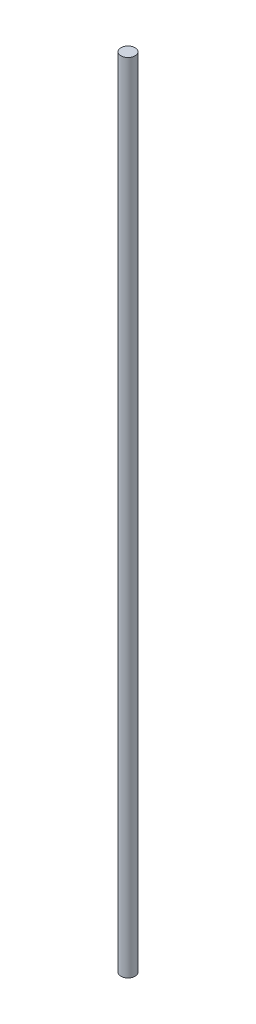
ISO-10303-21;
HEADER;
FILE_DESCRIPTION(('STEP AP214'),'2;1');
FILE_NAME('part.step','',(''),(''),'','','');
FILE_SCHEMA(('AUTOMOTIVE_DESIGN { 1 0 10303 214 1 1 1 1 }'));
ENDSEC;
DATA;
#1=APPLICATION_CONTEXT('core data for automotive mechanical design processes');
#2=APPLICATION_PROTOCOL_DEFINITION('international standard','automotive_design',2000,#1);
#3=PRODUCT_CONTEXT('',#1,'mechanical');
#4=PRODUCT('Part','Part','',(#3));
#5=PRODUCT_RELATED_PRODUCT_CATEGORY('part','',(#4));
#6=PRODUCT_DEFINITION_FORMATION('','',#4);
#7=PRODUCT_DEFINITION_CONTEXT('part definition',#1,'design');
#8=PRODUCT_DEFINITION('design','',#6,#7);
#9=PRODUCT_DEFINITION_SHAPE('','',#8);
#10=(LENGTH_UNIT() NAMED_UNIT(*) SI_UNIT(.MILLI.,.METRE.));
#11=(NAMED_UNIT(*) PLANE_ANGLE_UNIT() SI_UNIT($,.RADIAN.));
#12=(NAMED_UNIT(*) SI_UNIT($,.STERADIAN.) SOLID_ANGLE_UNIT());
#13=UNCERTAINTY_MEASURE_WITH_UNIT(LENGTH_MEASURE(1.E-05),#10,'distance_accuracy_value','');
#14=(GEOMETRIC_REPRESENTATION_CONTEXT(3) GLOBAL_UNCERTAINTY_ASSIGNED_CONTEXT((#13)) GLOBAL_UNIT_ASSIGNED_CONTEXT((#10,
#11,#12)) REPRESENTATION_CONTEXT('',''));
#15=CARTESIAN_POINT('',(0.,0.,0.));
#16=DIRECTION('',(0.,0.,1.));
#17=DIRECTION('',(1.,0.,0.));
#18=AXIS2_PLACEMENT_3D('',#15,#16,#17);
#19=CARTESIAN_POINT('',(0.,680.,0.));
#20=DIRECTION('',(0.,-1.,0.));
#21=DIRECTION('',(0.,0.,-1.));
#22=AXIS2_PLACEMENT_3D('',#19,#20,#21);
#23=CYLINDRICAL_SURFACE('',#22,6.);
#24=CARTESIAN_POINT('',(0.,680.,0.));
#25=DIRECTION('',(0.,1.,0.));
#26=DIRECTION('',(0.,0.,1.));
#27=AXIS2_PLACEMENT_3D('',#24,#25,#26);
#28=CIRCLE('',#27,6.);
#29=CARTESIAN_POINT('',(0.,680.,6.));
#30=VERTEX_POINT('',#29);
#31=EDGE_CURVE('E10',#30,#30,#28,.T.);
#32=ORIENTED_EDGE('',*,*,#31,.F.);
#33=EDGE_LOOP('',(#32));
#34=FACE_BOUND('',#33,.T.);
#35=CARTESIAN_POINT('',(0.,0.,0.));
#36=DIRECTION('',(0.,1.,0.));
#37=DIRECTION('',(0.,0.,1.));
#38=AXIS2_PLACEMENT_3D('',#35,#36,#37);
#39=CIRCLE('',#38,6.);
#40=CARTESIAN_POINT('',(0.,0.,6.));
#41=VERTEX_POINT('',#40);
#42=EDGE_CURVE('E38',#41,#41,#39,.T.);
#43=ORIENTED_EDGE('',*,*,#42,.T.);
#44=EDGE_LOOP('',(#43));
#45=FACE_BOUND('',#44,.T.);
#46=ADVANCED_FACE('F35',(#34,#45),#23,.T.);
#47=CARTESIAN_POINT('',(0.,680.,0.));
#48=DIRECTION('',(0.,1.,0.));
#49=DIRECTION('',(0.,0.,1.));
#50=AXIS2_PLACEMENT_3D('',#47,#48,#49);
#51=PLANE('',#50);
#52=ORIENTED_EDGE('',*,*,#31,.T.);
#53=EDGE_LOOP('',(#52));
#54=FACE_BOUND('',#53,.T.);
#55=ADVANCED_FACE('F50',(#54),#51,.T.);
#56=CARTESIAN_POINT('',(0.,0.,0.));
#57=DIRECTION('',(0.,1.,0.));
#58=DIRECTION('',(0.,0.,1.));
#59=AXIS2_PLACEMENT_3D('',#56,#57,#58);
#60=PLANE('',#59);
#61=ORIENTED_EDGE('',*,*,#42,.F.);
#62=EDGE_LOOP('',(#61));
#63=FACE_BOUND('',#62,.T.);
#64=ADVANCED_FACE('F48',(#63),#60,.F.);
#65=CLOSED_SHELL('',(#46,#55,#64));
#66=MANIFOLD_SOLID_BREP('B2',#65);
#67=ADVANCED_BREP_SHAPE_REPRESENTATION('',(#18,#66),#14);
#68=SHAPE_DEFINITION_REPRESENTATION(#9,#67);
ENDSEC;
END-ISO-10303-21;
